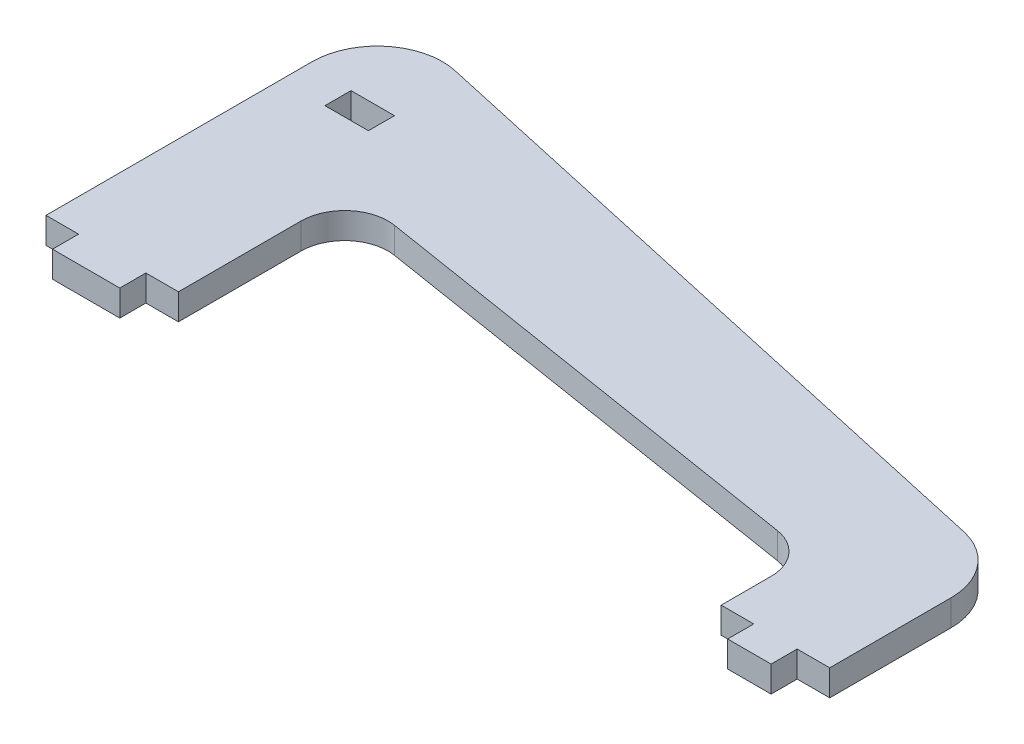
ISO-10303-21;
HEADER;
FILE_DESCRIPTION(('STEP AP214'),'2;1');
FILE_NAME('part.step','',(''),(''),'','','');
FILE_SCHEMA(('AUTOMOTIVE_DESIGN { 1 0 10303 214 1 1 1 1 }'));
ENDSEC;
DATA;
#1=APPLICATION_CONTEXT('core data for automotive mechanical design processes');
#2=APPLICATION_PROTOCOL_DEFINITION('international standard','automotive_design',2000,#1);
#3=PRODUCT_CONTEXT('',#1,'mechanical');
#4=PRODUCT('Part','Part','',(#3));
#5=PRODUCT_RELATED_PRODUCT_CATEGORY('part','',(#4));
#6=PRODUCT_DEFINITION_FORMATION('','',#4);
#7=PRODUCT_DEFINITION_CONTEXT('part definition',#1,'design');
#8=PRODUCT_DEFINITION('design','',#6,#7);
#9=PRODUCT_DEFINITION_SHAPE('','',#8);
#10=(LENGTH_UNIT() NAMED_UNIT(*) SI_UNIT(.MILLI.,.METRE.));
#11=(NAMED_UNIT(*) PLANE_ANGLE_UNIT() SI_UNIT($,.RADIAN.));
#12=(NAMED_UNIT(*) SI_UNIT($,.STERADIAN.) SOLID_ANGLE_UNIT());
#13=UNCERTAINTY_MEASURE_WITH_UNIT(LENGTH_MEASURE(1.E-05),#10,'distance_accuracy_value','');
#14=(GEOMETRIC_REPRESENTATION_CONTEXT(3) GLOBAL_UNCERTAINTY_ASSIGNED_CONTEXT((#13)) GLOBAL_UNIT_ASSIGNED_CONTEXT((#10,
#11,#12)) REPRESENTATION_CONTEXT('',''));
#15=CARTESIAN_POINT('',(0.,0.,0.));
#16=DIRECTION('',(0.,0.,1.));
#17=DIRECTION('',(1.,0.,0.));
#18=AXIS2_PLACEMENT_3D('',#15,#16,#17);
#19=CARTESIAN_POINT('',(2.5,6.,-37.6823685563129));
#20=DIRECTION('',(0.,1.,0.));
#21=DIRECTION('',(0.,0.,1.));
#22=AXIS2_PLACEMENT_3D('',#19,#20,#21);
#23=PLANE('',#22);
#24=DIRECTION('',(0.,0.,-1.));
#25=VECTOR('',#24,1.);
#26=CARTESIAN_POINT('',(10.,6.,-3.72217585492199));
#27=LINE('',#26,#25);
#28=CARTESIAN_POINT('',(10.,6.,-3.72217585492199));
#29=VERTEX_POINT('',#28);
#30=CARTESIAN_POINT('',(10.,6.,-9.72217585492199));
#31=VERTEX_POINT('',#30);
#32=EDGE_CURVE('E232',#29,#31,#27,.T.);
#33=ORIENTED_EDGE('',*,*,#32,.T.);
#34=DIRECTION('',(1.,0.,0.));
#35=VECTOR('',#34,1.);
#36=CARTESIAN_POINT('',(10.,6.,-9.72217585492199));
#37=LINE('',#36,#35);
#38=CARTESIAN_POINT('',(17.5,6.,-9.72217585492199));
#39=VERTEX_POINT('',#38);
#40=EDGE_CURVE('E235',#31,#39,#37,.T.);
#41=ORIENTED_EDGE('',*,*,#40,.T.);
#42=DIRECTION('',(0.,0.,-1.));
#43=VECTOR('',#42,1.);
#44=CARTESIAN_POINT('',(17.5,6.,-9.72217585492199));
#45=LINE('',#44,#43);
#46=CARTESIAN_POINT('',(17.5,6.,-37.6823685563129));
#47=VERTEX_POINT('',#46);
#48=EDGE_CURVE('E238',#39,#47,#45,.T.);
#49=ORIENTED_EDGE('',*,*,#48,.T.);
#50=CARTESIAN_POINT('',(2.5,6.,-37.6823685563129));
#51=DIRECTION('',(0.,1.,0.));
#52=DIRECTION('',(0.,0.,1.));
#53=AXIS2_PLACEMENT_3D('',#50,#51,#52);
#54=CIRCLE('',#53,15.);
#55=CARTESIAN_POINT('',(5.74536563354445,6.,-52.3270809776822));
#56=VERTEX_POINT('',#55);
#57=EDGE_CURVE('E240',#47,#56,#54,.T.);
#58=ORIENTED_EDGE('',*,*,#57,.T.);
#59=DIRECTION('',(-0.976314161424621,0.,-0.216357708902963));
#60=VECTOR('',#59,1.);
#61=CARTESIAN_POINT('',(5.74536563354445,6.,-52.3270809776822));
#62=LINE('',#61,#60);
#63=CARTESIAN_POINT('',(-144.754634366456,6.,-85.6788815316988));
#64=VERTEX_POINT('',#63);
#65=EDGE_CURVE('E242',#56,#64,#62,.T.);
#66=ORIENTED_EDGE('',*,*,#65,.T.);
#67=CARTESIAN_POINT('',(-148.,6.,-71.0341691103295));
#68=DIRECTION('',(0.,1.,0.));
#69=DIRECTION('',(0.,0.,-1.));
#70=AXIS2_PLACEMENT_3D('',#67,#68,#69);
#71=CIRCLE('',#70,15.);
#72=CARTESIAN_POINT('',(-163.,6.,-71.0341691103295));
#73=VERTEX_POINT('',#72);
#74=EDGE_CURVE('E244',#64,#73,#71,.T.);
#75=ORIENTED_EDGE('',*,*,#74,.T.);
#76=DIRECTION('',(0.,0.,1.));
#77=VECTOR('',#76,1.);
#78=CARTESIAN_POINT('',(-163.,6.,-9.72217585492198));
#79=LINE('',#78,#77);
#80=CARTESIAN_POINT('',(-163.,6.,-9.72217585492198));
#81=VERTEX_POINT('',#80);
#82=EDGE_CURVE('E246',#73,#81,#79,.T.);
#83=ORIENTED_EDGE('',*,*,#82,.T.);
#84=DIRECTION('',(1.,0.,0.));
#85=VECTOR('',#84,1.);
#86=CARTESIAN_POINT('',(-155.5,6.,-9.72217585492198));
#87=LINE('',#86,#85);
#88=CARTESIAN_POINT('',(-155.5,6.,-9.72217585492198));
#89=VERTEX_POINT('',#88);
#90=EDGE_CURVE('E248',#81,#89,#87,.T.);
#91=ORIENTED_EDGE('',*,*,#90,.T.);
#92=DIRECTION('',(0.,0.,1.));
#93=VECTOR('',#92,1.);
#94=CARTESIAN_POINT('',(-155.5,6.,-3.72217585492198));
#95=LINE('',#94,#93);
#96=CARTESIAN_POINT('',(-155.5,6.,-3.72217585492198));
#97=VERTEX_POINT('',#96);
#98=EDGE_CURVE('E250',#89,#97,#95,.T.);
#99=ORIENTED_EDGE('',*,*,#98,.T.);
#100=DIRECTION('',(1.,0.,0.));
#101=VECTOR('',#100,1.);
#102=CARTESIAN_POINT('',(-140.,6.,-3.72217585492199));
#103=LINE('',#102,#101);
#104=CARTESIAN_POINT('',(-140.,6.,-3.72217585492199));
#105=VERTEX_POINT('',#104);
#106=EDGE_CURVE('E252',#97,#105,#103,.T.);
#107=ORIENTED_EDGE('',*,*,#106,.T.);
#108=DIRECTION('',(0.,0.,-1.));
#109=VECTOR('',#108,1.);
#110=CARTESIAN_POINT('',(-140.,6.,-9.72217585492199));
#111=LINE('',#110,#109);
#112=CARTESIAN_POINT('',(-140.,6.,-9.72217585492199));
#113=VERTEX_POINT('',#112);
#114=EDGE_CURVE('E254',#105,#113,#111,.T.);
#115=ORIENTED_EDGE('',*,*,#114,.T.);
#116=DIRECTION('',(1.,0.,0.));
#117=VECTOR('',#116,1.);
#118=CARTESIAN_POINT('',(-132.5,6.,-9.72217585492199));
#119=LINE('',#118,#117);
#120=CARTESIAN_POINT('',(-132.5,6.,-9.72217585492199));
#121=VERTEX_POINT('',#120);
#122=EDGE_CURVE('E256',#113,#121,#119,.T.);
#123=ORIENTED_EDGE('',*,*,#122,.T.);
#124=DIRECTION('',(0.,0.,-1.));
#125=VECTOR('',#124,1.);
#126=CARTESIAN_POINT('',(-132.5,6.,-37.9949847339843));
#127=LINE('',#126,#125);
#128=CARTESIAN_POINT('',(-132.5,6.,-37.9949847339843));
#129=VERTEX_POINT('',#128);
#130=EDGE_CURVE('E258',#121,#129,#127,.T.);
#131=ORIENTED_EDGE('',*,*,#130,.T.);
#132=CARTESIAN_POINT('',(-122.5,6.,-37.9949847339843));
#133=DIRECTION('',(0.,-1.,0.));
#134=DIRECTION('',(0.,0.,1.));
#135=AXIS2_PLACEMENT_3D('',#132,#133,#134);
#136=CIRCLE('',#135,9.99999999999998);
#137=CARTESIAN_POINT('',(-120.920094988933,6.,-47.8693910531513));
#138=VERTEX_POINT('',#137);
#139=EDGE_CURVE('E260',#129,#138,#136,.T.);
#140=ORIENTED_EDGE('',*,*,#139,.T.);
#141=DIRECTION('',(0.987440631916705,0.,0.157990501106673));
#142=VECTOR('',#141,1.);
#143=CARTESIAN_POINT('',(-15.9200949889333,6.,-31.0693910531513));
#144=LINE('',#143,#142);
#145=CARTESIAN_POINT('',(-15.9200949889333,6.,-31.0693910531513));
#146=VERTEX_POINT('',#145);
#147=EDGE_CURVE('E262',#138,#146,#144,.T.);
#148=ORIENTED_EDGE('',*,*,#147,.T.);
#149=CARTESIAN_POINT('',(-17.5,6.,-21.1949847339843));
#150=DIRECTION('',(0.,-1.,0.));
#151=DIRECTION('',(0.,0.,1.));
#152=AXIS2_PLACEMENT_3D('',#149,#150,#151);
#153=CIRCLE('',#152,10.);
#154=CARTESIAN_POINT('',(-7.5,6.,-21.1949847339843));
#155=VERTEX_POINT('',#154);
#156=EDGE_CURVE('E264',#146,#155,#153,.T.);
#157=ORIENTED_EDGE('',*,*,#156,.T.);
#158=DIRECTION('',(0.,0.,1.));
#159=VECTOR('',#158,1.);
#160=CARTESIAN_POINT('',(-7.5,6.,-9.72217585492199));
#161=LINE('',#160,#159);
#162=CARTESIAN_POINT('',(-7.5,6.,-9.72217585492199));
#163=VERTEX_POINT('',#162);
#164=EDGE_CURVE('E266',#155,#163,#161,.T.);
#165=ORIENTED_EDGE('',*,*,#164,.T.);
#166=DIRECTION('',(1.,0.,0.));
#167=VECTOR('',#166,1.);
#168=CARTESIAN_POINT('',(0.,6.,-9.72217585492199));
#169=LINE('',#168,#167);
#170=CARTESIAN_POINT('',(0.,6.,-9.72217585492199));
#171=VERTEX_POINT('',#170);
#172=EDGE_CURVE('E268',#163,#171,#169,.T.);
#173=ORIENTED_EDGE('',*,*,#172,.T.);
#174=DIRECTION('',(0.,0.,1.));
#175=VECTOR('',#174,1.);
#176=CARTESIAN_POINT('',(0.,6.,-9.72217585492199));
#177=LINE('',#176,#175);
#178=CARTESIAN_POINT('',(0.,6.,-3.72217585492199));
#179=VERTEX_POINT('',#178);
#180=EDGE_CURVE('E270',#171,#179,#177,.T.);
#181=ORIENTED_EDGE('',*,*,#180,.T.);
#182=DIRECTION('',(1.,0.,0.));
#183=VECTOR('',#182,1.);
#184=CARTESIAN_POINT('',(0.,6.,-3.72217585492199));
#185=LINE('',#184,#183);
#186=EDGE_CURVE('E272',#179,#29,#185,.T.);
#187=ORIENTED_EDGE('',*,*,#186,.T.);
#188=EDGE_LOOP('',(#33,#41,#49,#58,#66,#75,#83,#91,#99,#107,#115,#123,#131,#140,#148,#157,#165,
#173,#181,#187));
#189=FACE_BOUND('',#188,.T.);
#190=DIRECTION('',(-1.,0.,0.));
#191=VECTOR('',#190,1.);
#192=CARTESIAN_POINT('',(-142.75,6.,-69.722175854922));
#193=LINE('',#192,#191);
#194=CARTESIAN_POINT('',(-142.75,6.,-69.722175854922));
#195=VERTEX_POINT('',#194);
#196=CARTESIAN_POINT('',(-152.75,6.,-69.722175854922));
#197=VERTEX_POINT('',#196);
#198=EDGE_CURVE('E204',#195,#197,#193,.T.);
#199=ORIENTED_EDGE('',*,*,#198,.F.);
#200=DIRECTION('',(0.,0.,-1.));
#201=VECTOR('',#200,1.);
#202=CARTESIAN_POINT('',(-142.75,6.,-63.722175854922));
#203=LINE('',#202,#201);
#204=CARTESIAN_POINT('',(-142.75,6.,-63.722175854922));
#205=VERTEX_POINT('',#204);
#206=EDGE_CURVE('E196',#205,#195,#203,.T.);
#207=ORIENTED_EDGE('',*,*,#206,.F.);
#208=DIRECTION('',(1.,0.,0.));
#209=VECTOR('',#208,1.);
#210=CARTESIAN_POINT('',(-152.75,6.,-63.722175854922));
#211=LINE('',#210,#209);
#212=CARTESIAN_POINT('',(-152.75,6.,-63.722175854922));
#213=VERTEX_POINT('',#212);
#214=EDGE_CURVE('E218',#213,#205,#211,.T.);
#215=ORIENTED_EDGE('',*,*,#214,.F.);
#216=DIRECTION('',(0.,0.,1.));
#217=VECTOR('',#216,1.);
#218=CARTESIAN_POINT('',(-152.75,6.,-69.722175854922));
#219=LINE('',#218,#217);
#220=EDGE_CURVE('E216',#197,#213,#219,.T.);
#221=ORIENTED_EDGE('',*,*,#220,.F.);
#222=EDGE_LOOP('',(#199,#207,#215,#221));
#223=FACE_BOUND('',#222,.T.);
#224=ADVANCED_FACE('F35',(#189,#223),#23,.T.);
#225=CARTESIAN_POINT('',(2.5,0.,-37.6823685563129));
#226=DIRECTION('',(0.,1.,0.));
#227=DIRECTION('',(0.,0.,1.));
#228=AXIS2_PLACEMENT_3D('',#225,#226,#227);
#229=PLANE('',#228);
#230=DIRECTION('',(0.,0.,-1.));
#231=VECTOR('',#230,1.);
#232=CARTESIAN_POINT('',(10.,0.,-3.72217585492199));
#233=LINE('',#232,#231);
#234=CARTESIAN_POINT('',(10.,0.,-3.72217585492199));
#235=VERTEX_POINT('',#234);
#236=CARTESIAN_POINT('',(10.,0.,-9.72217585492199));
#237=VERTEX_POINT('',#236);
#238=EDGE_CURVE('E212',#235,#237,#233,.T.);
#239=ORIENTED_EDGE('',*,*,#238,.F.);
#240=DIRECTION('',(1.,0.,0.));
#241=VECTOR('',#240,1.);
#242=CARTESIAN_POINT('',(0.,0.,-3.72217585492199));
#243=LINE('',#242,#241);
#244=CARTESIAN_POINT('',(0.,0.,-3.72217585492199));
#245=VERTEX_POINT('',#244);
#246=EDGE_CURVE('E236',#245,#235,#243,.T.);
#247=ORIENTED_EDGE('',*,*,#246,.F.);
#248=DIRECTION('',(0.,0.,1.));
#249=VECTOR('',#248,1.);
#250=CARTESIAN_POINT('',(0.,0.,-9.72217585492199));
#251=LINE('',#250,#249);
#252=CARTESIAN_POINT('',(0.,0.,-9.72217585492199));
#253=VERTEX_POINT('',#252);
#254=EDGE_CURVE('E311',#253,#245,#251,.T.);
#255=ORIENTED_EDGE('',*,*,#254,.F.);
#256=DIRECTION('',(1.,0.,0.));
#257=VECTOR('',#256,1.);
#258=CARTESIAN_POINT('',(0.,0.,-9.72217585492199));
#259=LINE('',#258,#257);
#260=CARTESIAN_POINT('',(-7.5,0.,-9.72217585492199));
#261=VERTEX_POINT('',#260);
#262=EDGE_CURVE('E309',#261,#253,#259,.T.);
#263=ORIENTED_EDGE('',*,*,#262,.F.);
#264=DIRECTION('',(0.,0.,1.));
#265=VECTOR('',#264,1.);
#266=CARTESIAN_POINT('',(-7.5,0.,-9.72217585492199));
#267=LINE('',#266,#265);
#268=CARTESIAN_POINT('',(-7.5,0.,-21.1949847339843));
#269=VERTEX_POINT('',#268);
#270=EDGE_CURVE('E307',#269,#261,#267,.T.);
#271=ORIENTED_EDGE('',*,*,#270,.F.);
#272=CARTESIAN_POINT('',(-17.5,0.,-21.1949847339843));
#273=DIRECTION('',(0.,-1.,0.));
#274=DIRECTION('',(0.,0.,1.));
#275=AXIS2_PLACEMENT_3D('',#272,#273,#274);
#276=CIRCLE('',#275,10.);
#277=CARTESIAN_POINT('',(-15.9200949889333,0.,-31.0693910531513));
#278=VERTEX_POINT('',#277);
#279=EDGE_CURVE('E305',#278,#269,#276,.T.);
#280=ORIENTED_EDGE('',*,*,#279,.F.);
#281=DIRECTION('',(0.987440631916705,0.,0.157990501106673));
#282=VECTOR('',#281,1.);
#283=CARTESIAN_POINT('',(-15.9200949889333,0.,-31.0693910531513));
#284=LINE('',#283,#282);
#285=CARTESIAN_POINT('',(-120.920094988933,0.,-47.8693910531513));
#286=VERTEX_POINT('',#285);
#287=EDGE_CURVE('E303',#286,#278,#284,.T.);
#288=ORIENTED_EDGE('',*,*,#287,.F.);
#289=CARTESIAN_POINT('',(-122.5,0.,-37.9949847339843));
#290=DIRECTION('',(0.,-1.,0.));
#291=DIRECTION('',(0.,0.,1.));
#292=AXIS2_PLACEMENT_3D('',#289,#290,#291);
#293=CIRCLE('',#292,9.99999999999998);
#294=CARTESIAN_POINT('',(-132.5,0.,-37.9949847339843));
#295=VERTEX_POINT('',#294);
#296=EDGE_CURVE('E301',#295,#286,#293,.T.);
#297=ORIENTED_EDGE('',*,*,#296,.F.);
#298=DIRECTION('',(0.,0.,-1.));
#299=VECTOR('',#298,1.);
#300=CARTESIAN_POINT('',(-132.5,0.,-37.9949847339843));
#301=LINE('',#300,#299);
#302=CARTESIAN_POINT('',(-132.5,0.,-9.72217585492199));
#303=VERTEX_POINT('',#302);
#304=EDGE_CURVE('E299',#303,#295,#301,.T.);
#305=ORIENTED_EDGE('',*,*,#304,.F.);
#306=DIRECTION('',(1.,0.,0.));
#307=VECTOR('',#306,1.);
#308=CARTESIAN_POINT('',(-132.5,0.,-9.72217585492199));
#309=LINE('',#308,#307);
#310=CARTESIAN_POINT('',(-140.,0.,-9.72217585492199));
#311=VERTEX_POINT('',#310);
#312=EDGE_CURVE('E297',#311,#303,#309,.T.);
#313=ORIENTED_EDGE('',*,*,#312,.F.);
#314=DIRECTION('',(0.,0.,-1.));
#315=VECTOR('',#314,1.);
#316=CARTESIAN_POINT('',(-140.,0.,-9.72217585492199));
#317=LINE('',#316,#315);
#318=CARTESIAN_POINT('',(-140.,0.,-3.72217585492199));
#319=VERTEX_POINT('',#318);
#320=EDGE_CURVE('E295',#319,#311,#317,.T.);
#321=ORIENTED_EDGE('',*,*,#320,.F.);
#322=DIRECTION('',(1.,0.,0.));
#323=VECTOR('',#322,1.);
#324=CARTESIAN_POINT('',(-140.,0.,-3.72217585492199));
#325=LINE('',#324,#323);
#326=CARTESIAN_POINT('',(-155.5,0.,-3.72217585492198));
#327=VERTEX_POINT('',#326);
#328=EDGE_CURVE('E293',#327,#319,#325,.T.);
#329=ORIENTED_EDGE('',*,*,#328,.F.);
#330=DIRECTION('',(0.,0.,1.));
#331=VECTOR('',#330,1.);
#332=CARTESIAN_POINT('',(-155.5,0.,-3.72217585492198));
#333=LINE('',#332,#331);
#334=CARTESIAN_POINT('',(-155.5,0.,-9.72217585492198));
#335=VERTEX_POINT('',#334);
#336=EDGE_CURVE('E291',#335,#327,#333,.T.);
#337=ORIENTED_EDGE('',*,*,#336,.F.);
#338=DIRECTION('',(1.,0.,0.));
#339=VECTOR('',#338,1.);
#340=CARTESIAN_POINT('',(-155.5,0.,-9.72217585492198));
#341=LINE('',#340,#339);
#342=CARTESIAN_POINT('',(-163.,0.,-9.72217585492198));
#343=VERTEX_POINT('',#342);
#344=EDGE_CURVE('E289',#343,#335,#341,.T.);
#345=ORIENTED_EDGE('',*,*,#344,.F.);
#346=DIRECTION('',(0.,0.,1.));
#347=VECTOR('',#346,1.);
#348=CARTESIAN_POINT('',(-163.,0.,-9.72217585492198));
#349=LINE('',#348,#347);
#350=CARTESIAN_POINT('',(-163.,0.,-71.0341691103295));
#351=VERTEX_POINT('',#350);
#352=EDGE_CURVE('E287',#351,#343,#349,.T.);
#353=ORIENTED_EDGE('',*,*,#352,.F.);
#354=CARTESIAN_POINT('',(-148.,0.,-71.0341691103295));
#355=DIRECTION('',(0.,1.,0.));
#356=DIRECTION('',(0.,0.,-1.));
#357=AXIS2_PLACEMENT_3D('',#354,#355,#356);
#358=CIRCLE('',#357,15.);
#359=CARTESIAN_POINT('',(-144.754634366456,0.,-85.6788815316988));
#360=VERTEX_POINT('',#359);
#361=EDGE_CURVE('E285',#360,#351,#358,.T.);
#362=ORIENTED_EDGE('',*,*,#361,.F.);
#363=DIRECTION('',(-0.976314161424621,0.,-0.216357708902963));
#364=VECTOR('',#363,1.);
#365=CARTESIAN_POINT('',(5.74536563354445,0.,-52.3270809776822));
#366=LINE('',#365,#364);
#367=CARTESIAN_POINT('',(5.74536563354445,0.,-52.3270809776822));
#368=VERTEX_POINT('',#367);
#369=EDGE_CURVE('E283',#368,#360,#366,.T.);
#370=ORIENTED_EDGE('',*,*,#369,.F.);
#371=CARTESIAN_POINT('',(2.5,0.,-37.6823685563129));
#372=DIRECTION('',(0.,1.,0.));
#373=DIRECTION('',(0.,0.,1.));
#374=AXIS2_PLACEMENT_3D('',#371,#372,#373);
#375=CIRCLE('',#374,15.);
#376=CARTESIAN_POINT('',(17.5,0.,-37.6823685563129));
#377=VERTEX_POINT('',#376);
#378=EDGE_CURVE('E281',#377,#368,#375,.T.);
#379=ORIENTED_EDGE('',*,*,#378,.F.);
#380=DIRECTION('',(0.,0.,-1.));
#381=VECTOR('',#380,1.);
#382=CARTESIAN_POINT('',(17.5,0.,-9.72217585492199));
#383=LINE('',#382,#381);
#384=CARTESIAN_POINT('',(17.5,0.,-9.72217585492199));
#385=VERTEX_POINT('',#384);
#386=EDGE_CURVE('E279',#385,#377,#383,.T.);
#387=ORIENTED_EDGE('',*,*,#386,.F.);
#388=DIRECTION('',(1.,0.,0.));
#389=VECTOR('',#388,1.);
#390=CARTESIAN_POINT('',(10.,0.,-9.72217585492199));
#391=LINE('',#390,#389);
#392=EDGE_CURVE('E277',#237,#385,#391,.T.);
#393=ORIENTED_EDGE('',*,*,#392,.F.);
#394=EDGE_LOOP('',(#239,#247,#255,#263,#271,#280,#288,#297,#305,#313,#321,#329,#337,#345,#353,
#362,#370,#379,#387,#393));
#395=FACE_BOUND('',#394,.T.);
#396=DIRECTION('',(0.,0.,-1.));
#397=VECTOR('',#396,1.);
#398=CARTESIAN_POINT('',(-142.75,0.,-63.722175854922));
#399=LINE('',#398,#397);
#400=CARTESIAN_POINT('',(-142.75,0.,-63.722175854922));
#401=VERTEX_POINT('',#400);
#402=CARTESIAN_POINT('',(-142.75,0.,-69.722175854922));
#403=VERTEX_POINT('',#402);
#404=EDGE_CURVE('E58',#401,#403,#399,.T.);
#405=ORIENTED_EDGE('',*,*,#404,.T.);
#406=DIRECTION('',(-1.,0.,0.));
#407=VECTOR('',#406,1.);
#408=CARTESIAN_POINT('',(-142.75,0.,-69.722175854922));
#409=LINE('',#408,#407);
#410=CARTESIAN_POINT('',(-152.75,0.,-69.722175854922));
#411=VERTEX_POINT('',#410);
#412=EDGE_CURVE('E211',#403,#411,#409,.T.);
#413=ORIENTED_EDGE('',*,*,#412,.T.);
#414=DIRECTION('',(0.,0.,1.));
#415=VECTOR('',#414,1.);
#416=CARTESIAN_POINT('',(-152.75,0.,-69.722175854922));
#417=LINE('',#416,#415);
#418=CARTESIAN_POINT('',(-152.75,0.,-63.722175854922));
#419=VERTEX_POINT('',#418);
#420=EDGE_CURVE('E224',#411,#419,#417,.T.);
#421=ORIENTED_EDGE('',*,*,#420,.T.);
#422=DIRECTION('',(1.,0.,0.));
#423=VECTOR('',#422,1.);
#424=CARTESIAN_POINT('',(-152.75,0.,-63.722175854922));
#425=LINE('',#424,#423);
#426=EDGE_CURVE('E205',#419,#401,#425,.T.);
#427=ORIENTED_EDGE('',*,*,#426,.T.);
#428=EDGE_LOOP('',(#405,#413,#421,#427));
#429=FACE_BOUND('',#428,.T.);
#430=ADVANCED_FACE('F377',(#395,#429),#229,.F.);
#431=CARTESIAN_POINT('',(10.,6.,-3.72217585492199));
#432=DIRECTION('',(-1.,0.,0.));
#433=DIRECTION('',(0.,0.,1.));
#434=AXIS2_PLACEMENT_3D('',#431,#432,#433);
#435=PLANE('',#434);
#436=ORIENTED_EDGE('',*,*,#238,.T.);
#437=DIRECTION('',(0.,-1.,0.));
#438=VECTOR('',#437,1.);
#439=CARTESIAN_POINT('',(10.,6.,-9.72217585492199));
#440=LINE('',#439,#438);
#441=EDGE_CURVE('E11',#31,#237,#440,.T.);
#442=ORIENTED_EDGE('',*,*,#441,.F.);
#443=ORIENTED_EDGE('',*,*,#32,.F.);
#444=DIRECTION('',(0.,-1.,0.));
#445=VECTOR('',#444,1.);
#446=CARTESIAN_POINT('',(10.,6.,-3.72217585492199));
#447=LINE('',#446,#445);
#448=EDGE_CURVE('E274',#29,#235,#447,.T.);
#449=ORIENTED_EDGE('',*,*,#448,.T.);
#450=EDGE_LOOP('',(#436,#442,#443,#449));
#451=FACE_BOUND('',#450,.T.);
#452=ADVANCED_FACE('F37',(#451),#435,.F.);
#453=CARTESIAN_POINT('',(10.,6.,-9.72217585492199));
#454=DIRECTION('',(0.,0.,-1.));
#455=DIRECTION('',(-1.,0.,0.));
#456=AXIS2_PLACEMENT_3D('',#453,#454,#455);
#457=PLANE('',#456);
#458=ORIENTED_EDGE('',*,*,#392,.T.);
#459=DIRECTION('',(0.,-1.,0.));
#460=VECTOR('',#459,1.);
#461=CARTESIAN_POINT('',(17.5,6.,-9.72217585492199));
#462=LINE('',#461,#460);
#463=EDGE_CURVE('E43',#39,#385,#462,.T.);
#464=ORIENTED_EDGE('',*,*,#463,.F.);
#465=ORIENTED_EDGE('',*,*,#40,.F.);
#466=ORIENTED_EDGE('',*,*,#441,.T.);
#467=EDGE_LOOP('',(#458,#464,#465,#466));
#468=FACE_BOUND('',#467,.T.);
#469=ADVANCED_FACE('F394',(#468),#457,.F.);
#470=CARTESIAN_POINT('',(17.5,6.,-9.72217585492199));
#471=DIRECTION('',(-1.,0.,0.));
#472=DIRECTION('',(0.,0.,1.));
#473=AXIS2_PLACEMENT_3D('',#470,#471,#472);
#474=PLANE('',#473);
#475=ORIENTED_EDGE('',*,*,#386,.T.);
#476=DIRECTION('',(0.,-1.,0.));
#477=VECTOR('',#476,1.);
#478=CARTESIAN_POINT('',(17.5,6.,-37.6823685563129));
#479=LINE('',#478,#477);
#480=EDGE_CURVE('E364',#47,#377,#479,.T.);
#481=ORIENTED_EDGE('',*,*,#480,.F.);
#482=ORIENTED_EDGE('',*,*,#48,.F.);
#483=ORIENTED_EDGE('',*,*,#463,.T.);
#484=EDGE_LOOP('',(#475,#481,#482,#483));
#485=FACE_BOUND('',#484,.T.);
#486=ADVANCED_FACE('F371',(#485),#474,.F.);
#487=CARTESIAN_POINT('',(2.5,6.,-37.6823685563129));
#488=DIRECTION('',(0.,-1.,0.));
#489=DIRECTION('',(0.,0.,-1.));
#490=AXIS2_PLACEMENT_3D('',#487,#488,#489);
#491=CYLINDRICAL_SURFACE('',#490,15.);
#492=ORIENTED_EDGE('',*,*,#378,.T.);
#493=DIRECTION('',(0.,-1.,0.));
#494=VECTOR('',#493,1.);
#495=CARTESIAN_POINT('',(5.74536563354445,6.,-52.3270809776822));
#496=LINE('',#495,#494);
#497=EDGE_CURVE('E361',#56,#368,#496,.T.);
#498=ORIENTED_EDGE('',*,*,#497,.F.);
#499=ORIENTED_EDGE('',*,*,#57,.F.);
#500=ORIENTED_EDGE('',*,*,#480,.T.);
#501=EDGE_LOOP('',(#492,#498,#499,#500));
#502=FACE_BOUND('',#501,.T.);
#503=ADVANCED_FACE('F383',(#502),#491,.T.);
#504=CARTESIAN_POINT('',(5.74536563354445,6.,-52.3270809776822));
#505=DIRECTION('',(-0.216357708902963,0.,0.976314161424621));
#506=DIRECTION('',(0.976314161424621,0.,0.216357708902963));
#507=AXIS2_PLACEMENT_3D('',#504,#505,#506);
#508=PLANE('',#507);
#509=ORIENTED_EDGE('',*,*,#369,.T.);
#510=DIRECTION('',(0.,-1.,0.));
#511=VECTOR('',#510,1.);
#512=CARTESIAN_POINT('',(-144.754634366456,6.,-85.6788815316988));
#513=LINE('',#512,#511);
#514=EDGE_CURVE('E358',#64,#360,#513,.T.);
#515=ORIENTED_EDGE('',*,*,#514,.F.);
#516=ORIENTED_EDGE('',*,*,#65,.F.);
#517=ORIENTED_EDGE('',*,*,#497,.T.);
#518=EDGE_LOOP('',(#509,#515,#516,#517));
#519=FACE_BOUND('',#518,.T.);
#520=ADVANCED_FACE('F387',(#519),#508,.F.);
#521=CARTESIAN_POINT('',(-148.,6.,-71.0341691103295));
#522=DIRECTION('',(0.,-1.,0.));
#523=DIRECTION('',(0.,0.,-1.));
#524=AXIS2_PLACEMENT_3D('',#521,#522,#523);
#525=CYLINDRICAL_SURFACE('',#524,15.);
#526=ORIENTED_EDGE('',*,*,#361,.T.);
#527=DIRECTION('',(0.,-1.,0.));
#528=VECTOR('',#527,1.);
#529=CARTESIAN_POINT('',(-163.,6.,-71.0341691103295));
#530=LINE('',#529,#528);
#531=EDGE_CURVE('E355',#73,#351,#530,.T.);
#532=ORIENTED_EDGE('',*,*,#531,.F.);
#533=ORIENTED_EDGE('',*,*,#74,.F.);
#534=ORIENTED_EDGE('',*,*,#514,.T.);
#535=EDGE_LOOP('',(#526,#532,#533,#534));
#536=FACE_BOUND('',#535,.T.);
#537=ADVANCED_FACE('F467',(#536),#525,.T.);
#538=CARTESIAN_POINT('',(-163.,6.,-9.72217585492198));
#539=DIRECTION('',(1.,0.,0.));
#540=DIRECTION('',(0.,0.,-1.));
#541=AXIS2_PLACEMENT_3D('',#538,#539,#540);
#542=PLANE('',#541);
#543=ORIENTED_EDGE('',*,*,#352,.T.);
#544=DIRECTION('',(0.,-1.,0.));
#545=VECTOR('',#544,1.);
#546=CARTESIAN_POINT('',(-163.,6.,-9.72217585492198));
#547=LINE('',#546,#545);
#548=EDGE_CURVE('E352',#81,#343,#547,.T.);
#549=ORIENTED_EDGE('',*,*,#548,.F.);
#550=ORIENTED_EDGE('',*,*,#82,.F.);
#551=ORIENTED_EDGE('',*,*,#531,.T.);
#552=EDGE_LOOP('',(#543,#549,#550,#551));
#553=FACE_BOUND('',#552,.T.);
#554=ADVANCED_FACE('F465',(#553),#542,.F.);
#555=CARTESIAN_POINT('',(-155.5,6.,-9.72217585492198));
#556=DIRECTION('',(0.,0.,-1.));
#557=DIRECTION('',(-1.,0.,0.));
#558=AXIS2_PLACEMENT_3D('',#555,#556,#557);
#559=PLANE('',#558);
#560=ORIENTED_EDGE('',*,*,#344,.T.);
#561=DIRECTION('',(0.,-1.,0.));
#562=VECTOR('',#561,1.);
#563=CARTESIAN_POINT('',(-155.5,6.,-9.72217585492198));
#564=LINE('',#563,#562);
#565=EDGE_CURVE('E349',#89,#335,#564,.T.);
#566=ORIENTED_EDGE('',*,*,#565,.F.);
#567=ORIENTED_EDGE('',*,*,#90,.F.);
#568=ORIENTED_EDGE('',*,*,#548,.T.);
#569=EDGE_LOOP('',(#560,#566,#567,#568));
#570=FACE_BOUND('',#569,.T.);
#571=ADVANCED_FACE('F460',(#570),#559,.F.);
#572=CARTESIAN_POINT('',(-155.5,6.,-3.72217585492198));
#573=DIRECTION('',(1.,0.,0.));
#574=DIRECTION('',(0.,0.,-1.));
#575=AXIS2_PLACEMENT_3D('',#572,#573,#574);
#576=PLANE('',#575);
#577=ORIENTED_EDGE('',*,*,#336,.T.);
#578=DIRECTION('',(0.,-1.,0.));
#579=VECTOR('',#578,1.);
#580=CARTESIAN_POINT('',(-155.5,6.,-3.72217585492198));
#581=LINE('',#580,#579);
#582=EDGE_CURVE('E346',#97,#327,#581,.T.);
#583=ORIENTED_EDGE('',*,*,#582,.F.);
#584=ORIENTED_EDGE('',*,*,#98,.F.);
#585=ORIENTED_EDGE('',*,*,#565,.T.);
#586=EDGE_LOOP('',(#577,#583,#584,#585));
#587=FACE_BOUND('',#586,.T.);
#588=ADVANCED_FACE('F455',(#587),#576,.F.);
#589=CARTESIAN_POINT('',(-140.,6.,-3.72217585492199));
#590=DIRECTION('',(0.,0.,-1.));
#591=DIRECTION('',(-1.,0.,0.));
#592=AXIS2_PLACEMENT_3D('',#589,#590,#591);
#593=PLANE('',#592);
#594=ORIENTED_EDGE('',*,*,#328,.T.);
#595=DIRECTION('',(0.,-1.,0.));
#596=VECTOR('',#595,1.);
#597=CARTESIAN_POINT('',(-140.,6.,-3.72217585492199));
#598=LINE('',#597,#596);
#599=EDGE_CURVE('E343',#105,#319,#598,.T.);
#600=ORIENTED_EDGE('',*,*,#599,.F.);
#601=ORIENTED_EDGE('',*,*,#106,.F.);
#602=ORIENTED_EDGE('',*,*,#582,.T.);
#603=EDGE_LOOP('',(#594,#600,#601,#602));
#604=FACE_BOUND('',#603,.T.);
#605=ADVANCED_FACE('F451',(#604),#593,.F.);
#606=CARTESIAN_POINT('',(-140.,6.,-9.72217585492199));
#607=DIRECTION('',(-1.,0.,0.));
#608=DIRECTION('',(0.,0.,1.));
#609=AXIS2_PLACEMENT_3D('',#606,#607,#608);
#610=PLANE('',#609);
#611=ORIENTED_EDGE('',*,*,#320,.T.);
#612=DIRECTION('',(0.,-1.,0.));
#613=VECTOR('',#612,1.);
#614=CARTESIAN_POINT('',(-140.,6.,-9.72217585492199));
#615=LINE('',#614,#613);
#616=EDGE_CURVE('E340',#113,#311,#615,.T.);
#617=ORIENTED_EDGE('',*,*,#616,.F.);
#618=ORIENTED_EDGE('',*,*,#114,.F.);
#619=ORIENTED_EDGE('',*,*,#599,.T.);
#620=EDGE_LOOP('',(#611,#617,#618,#619));
#621=FACE_BOUND('',#620,.T.);
#622=ADVANCED_FACE('F446',(#621),#610,.F.);
#623=CARTESIAN_POINT('',(-132.5,6.,-9.72217585492199));
#624=DIRECTION('',(0.,0.,-1.));
#625=DIRECTION('',(-1.,0.,0.));
#626=AXIS2_PLACEMENT_3D('',#623,#624,#625);
#627=PLANE('',#626);
#628=ORIENTED_EDGE('',*,*,#312,.T.);
#629=DIRECTION('',(0.,-1.,0.));
#630=VECTOR('',#629,1.);
#631=CARTESIAN_POINT('',(-132.5,6.,-9.72217585492199));
#632=LINE('',#631,#630);
#633=EDGE_CURVE('E337',#121,#303,#632,.T.);
#634=ORIENTED_EDGE('',*,*,#633,.F.);
#635=ORIENTED_EDGE('',*,*,#122,.F.);
#636=ORIENTED_EDGE('',*,*,#616,.T.);
#637=EDGE_LOOP('',(#628,#634,#635,#636));
#638=FACE_BOUND('',#637,.T.);
#639=ADVANCED_FACE('F440',(#638),#627,.F.);
#640=CARTESIAN_POINT('',(-132.5,6.,-37.9949847339843));
#641=DIRECTION('',(-1.,0.,0.));
#642=DIRECTION('',(0.,0.,1.));
#643=AXIS2_PLACEMENT_3D('',#640,#641,#642);
#644=PLANE('',#643);
#645=ORIENTED_EDGE('',*,*,#304,.T.);
#646=DIRECTION('',(0.,-1.,0.));
#647=VECTOR('',#646,1.);
#648=CARTESIAN_POINT('',(-132.5,6.,-37.9949847339843));
#649=LINE('',#648,#647);
#650=EDGE_CURVE('E334',#129,#295,#649,.T.);
#651=ORIENTED_EDGE('',*,*,#650,.F.);
#652=ORIENTED_EDGE('',*,*,#130,.F.);
#653=ORIENTED_EDGE('',*,*,#633,.T.);
#654=EDGE_LOOP('',(#645,#651,#652,#653));
#655=FACE_BOUND('',#654,.T.);
#656=ADVANCED_FACE('F436',(#655),#644,.F.);
#657=CARTESIAN_POINT('',(-122.5,6.,-37.9949847339843));
#658=DIRECTION('',(0.,-1.,0.));
#659=DIRECTION('',(0.,0.,-1.));
#660=AXIS2_PLACEMENT_3D('',#657,#658,#659);
#661=CYLINDRICAL_SURFACE('',#660,9.99999999999998);
#662=ORIENTED_EDGE('',*,*,#296,.T.);
#663=DIRECTION('',(0.,-1.,0.));
#664=VECTOR('',#663,1.);
#665=CARTESIAN_POINT('',(-120.920094988933,6.,-47.8693910531513));
#666=LINE('',#665,#664);
#667=EDGE_CURVE('E331',#138,#286,#666,.T.);
#668=ORIENTED_EDGE('',*,*,#667,.F.);
#669=ORIENTED_EDGE('',*,*,#139,.F.);
#670=ORIENTED_EDGE('',*,*,#650,.T.);
#671=EDGE_LOOP('',(#662,#668,#669,#670));
#672=FACE_BOUND('',#671,.T.);
#673=ADVANCED_FACE('F431',(#672),#661,.F.);
#674=CARTESIAN_POINT('',(-15.9200949889333,6.,-31.0693910531513));
#675=DIRECTION('',(0.157990501106673,0.,-0.987440631916705));
#676=DIRECTION('',(-0.987440631916706,0.,-0.157990501106673));
#677=AXIS2_PLACEMENT_3D('',#674,#675,#676);
#678=PLANE('',#677);
#679=ORIENTED_EDGE('',*,*,#287,.T.);
#680=DIRECTION('',(0.,-1.,0.));
#681=VECTOR('',#680,1.);
#682=CARTESIAN_POINT('',(-15.9200949889333,6.,-31.0693910531513));
#683=LINE('',#682,#681);
#684=EDGE_CURVE('E328',#146,#278,#683,.T.);
#685=ORIENTED_EDGE('',*,*,#684,.F.);
#686=ORIENTED_EDGE('',*,*,#147,.F.);
#687=ORIENTED_EDGE('',*,*,#667,.T.);
#688=EDGE_LOOP('',(#679,#685,#686,#687));
#689=FACE_BOUND('',#688,.T.);
#690=ADVANCED_FACE('F425',(#689),#678,.F.);
#691=CARTESIAN_POINT('',(-17.5,6.,-21.1949847339843));
#692=DIRECTION('',(0.,-1.,0.));
#693=DIRECTION('',(0.,0.,-1.));
#694=AXIS2_PLACEMENT_3D('',#691,#692,#693);
#695=CYLINDRICAL_SURFACE('',#694,10.);
#696=ORIENTED_EDGE('',*,*,#279,.T.);
#697=DIRECTION('',(0.,-1.,0.));
#698=VECTOR('',#697,1.);
#699=CARTESIAN_POINT('',(-7.5,6.,-21.1949847339843));
#700=LINE('',#699,#698);
#701=EDGE_CURVE('E325',#155,#269,#700,.T.);
#702=ORIENTED_EDGE('',*,*,#701,.F.);
#703=ORIENTED_EDGE('',*,*,#156,.F.);
#704=ORIENTED_EDGE('',*,*,#684,.T.);
#705=EDGE_LOOP('',(#696,#702,#703,#704));
#706=FACE_BOUND('',#705,.T.);
#707=ADVANCED_FACE('F421',(#706),#695,.F.);
#708=CARTESIAN_POINT('',(-7.5,6.,-9.72217585492199));
#709=DIRECTION('',(1.,0.,0.));
#710=DIRECTION('',(0.,0.,-1.));
#711=AXIS2_PLACEMENT_3D('',#708,#709,#710);
#712=PLANE('',#711);
#713=ORIENTED_EDGE('',*,*,#270,.T.);
#714=DIRECTION('',(0.,-1.,0.));
#715=VECTOR('',#714,1.);
#716=CARTESIAN_POINT('',(-7.5,6.,-9.72217585492199));
#717=LINE('',#716,#715);
#718=EDGE_CURVE('E322',#163,#261,#717,.T.);
#719=ORIENTED_EDGE('',*,*,#718,.F.);
#720=ORIENTED_EDGE('',*,*,#164,.F.);
#721=ORIENTED_EDGE('',*,*,#701,.T.);
#722=EDGE_LOOP('',(#713,#719,#720,#721));
#723=FACE_BOUND('',#722,.T.);
#724=ADVANCED_FACE('F416',(#723),#712,.F.);
#725=CARTESIAN_POINT('',(0.,6.,-9.72217585492199));
#726=DIRECTION('',(0.,0.,-1.));
#727=DIRECTION('',(-1.,0.,0.));
#728=AXIS2_PLACEMENT_3D('',#725,#726,#727);
#729=PLANE('',#728);
#730=ORIENTED_EDGE('',*,*,#262,.T.);
#731=DIRECTION('',(0.,-1.,0.));
#732=VECTOR('',#731,1.);
#733=CARTESIAN_POINT('',(0.,6.,-9.72217585492199));
#734=LINE('',#733,#732);
#735=EDGE_CURVE('E319',#171,#253,#734,.T.);
#736=ORIENTED_EDGE('',*,*,#735,.F.);
#737=ORIENTED_EDGE('',*,*,#172,.F.);
#738=ORIENTED_EDGE('',*,*,#718,.T.);
#739=EDGE_LOOP('',(#730,#736,#737,#738));
#740=FACE_BOUND('',#739,.T.);
#741=ADVANCED_FACE('F410',(#740),#729,.F.);
#742=CARTESIAN_POINT('',(0.,6.,-9.72217585492199));
#743=DIRECTION('',(1.,0.,0.));
#744=DIRECTION('',(0.,0.,-1.));
#745=AXIS2_PLACEMENT_3D('',#742,#743,#744);
#746=PLANE('',#745);
#747=ORIENTED_EDGE('',*,*,#254,.T.);
#748=DIRECTION('',(0.,-1.,0.));
#749=VECTOR('',#748,1.);
#750=CARTESIAN_POINT('',(0.,6.,-3.72217585492199));
#751=LINE('',#750,#749);
#752=EDGE_CURVE('E316',#179,#245,#751,.T.);
#753=ORIENTED_EDGE('',*,*,#752,.F.);
#754=ORIENTED_EDGE('',*,*,#180,.F.);
#755=ORIENTED_EDGE('',*,*,#735,.T.);
#756=EDGE_LOOP('',(#747,#753,#754,#755));
#757=FACE_BOUND('',#756,.T.);
#758=ADVANCED_FACE('F406',(#757),#746,.F.);
#759=CARTESIAN_POINT('',(0.,6.,-3.72217585492199));
#760=DIRECTION('',(0.,0.,-1.));
#761=DIRECTION('',(-1.,0.,0.));
#762=AXIS2_PLACEMENT_3D('',#759,#760,#761);
#763=PLANE('',#762);
#764=ORIENTED_EDGE('',*,*,#246,.T.);
#765=ORIENTED_EDGE('',*,*,#448,.F.);
#766=ORIENTED_EDGE('',*,*,#186,.F.);
#767=ORIENTED_EDGE('',*,*,#752,.T.);
#768=EDGE_LOOP('',(#764,#765,#766,#767));
#769=FACE_BOUND('',#768,.T.);
#770=ADVANCED_FACE('F401',(#769),#763,.F.);
#771=CARTESIAN_POINT('',(-142.75,6.,-63.722175854922));
#772=DIRECTION('',(-1.,0.,0.));
#773=DIRECTION('',(0.,0.,1.));
#774=AXIS2_PLACEMENT_3D('',#771,#772,#773);
#775=PLANE('',#774);
#776=ORIENTED_EDGE('',*,*,#404,.F.);
#777=DIRECTION('',(0.,-1.,0.));
#778=VECTOR('',#777,1.);
#779=CARTESIAN_POINT('',(-142.75,6.,-63.722175854922));
#780=LINE('',#779,#778);
#781=EDGE_CURVE('E200',#205,#401,#780,.T.);
#782=ORIENTED_EDGE('',*,*,#781,.F.);
#783=ORIENTED_EDGE('',*,*,#206,.T.);
#784=DIRECTION('',(0.,-1.,0.));
#785=VECTOR('',#784,1.);
#786=CARTESIAN_POINT('',(-142.75,6.,-69.722175854922));
#787=LINE('',#786,#785);
#788=EDGE_CURVE('E199',#195,#403,#787,.T.);
#789=ORIENTED_EDGE('',*,*,#788,.T.);
#790=EDGE_LOOP('',(#776,#782,#783,#789));
#791=FACE_BOUND('',#790,.T.);
#792=ADVANCED_FACE('F198',(#791),#775,.T.);
#793=CARTESIAN_POINT('',(-142.75,6.,-69.722175854922));
#794=DIRECTION('',(0.,0.,1.));
#795=DIRECTION('',(1.,0.,0.));
#796=AXIS2_PLACEMENT_3D('',#793,#794,#795);
#797=PLANE('',#796);
#798=ORIENTED_EDGE('',*,*,#412,.F.);
#799=ORIENTED_EDGE('',*,*,#788,.F.);
#800=ORIENTED_EDGE('',*,*,#198,.T.);
#801=DIRECTION('',(0.,-1.,0.));
#802=VECTOR('',#801,1.);
#803=CARTESIAN_POINT('',(-152.75,6.,-69.722175854922));
#804=LINE('',#803,#802);
#805=EDGE_CURVE('E213',#197,#411,#804,.T.);
#806=ORIENTED_EDGE('',*,*,#805,.T.);
#807=EDGE_LOOP('',(#798,#799,#800,#806));
#808=FACE_BOUND('',#807,.T.);
#809=ADVANCED_FACE('F208',(#808),#797,.T.);
#810=CARTESIAN_POINT('',(-152.75,6.,-69.722175854922));
#811=DIRECTION('',(1.,0.,0.));
#812=DIRECTION('',(0.,0.,-1.));
#813=AXIS2_PLACEMENT_3D('',#810,#811,#812);
#814=PLANE('',#813);
#815=ORIENTED_EDGE('',*,*,#420,.F.);
#816=ORIENTED_EDGE('',*,*,#805,.F.);
#817=ORIENTED_EDGE('',*,*,#220,.T.);
#818=DIRECTION('',(0.,-1.,0.));
#819=VECTOR('',#818,1.);
#820=CARTESIAN_POINT('',(-152.75,6.,-63.722175854922));
#821=LINE('',#820,#819);
#822=EDGE_CURVE('E50',#213,#419,#821,.T.);
#823=ORIENTED_EDGE('',*,*,#822,.T.);
#824=EDGE_LOOP('',(#815,#816,#817,#823));
#825=FACE_BOUND('',#824,.T.);
#826=ADVANCED_FACE('F579',(#825),#814,.T.);
#827=CARTESIAN_POINT('',(-152.75,6.,-63.722175854922));
#828=DIRECTION('',(0.,0.,-1.));
#829=DIRECTION('',(-1.,0.,0.));
#830=AXIS2_PLACEMENT_3D('',#827,#828,#829);
#831=PLANE('',#830);
#832=ORIENTED_EDGE('',*,*,#426,.F.);
#833=ORIENTED_EDGE('',*,*,#822,.F.);
#834=ORIENTED_EDGE('',*,*,#214,.T.);
#835=ORIENTED_EDGE('',*,*,#781,.T.);
#836=EDGE_LOOP('',(#832,#833,#834,#835));
#837=FACE_BOUND('',#836,.T.);
#838=ADVANCED_FACE('F584',(#837),#831,.T.);
#839=CLOSED_SHELL('',(#224,#430,#452,#469,#486,#503,#520,#537,#554,#571,#588,#605,#622,#639,
#656,#673,#690,#707,#724,#741,#758,#770,#792,#809,#826,#838));
#840=MANIFOLD_SOLID_BREP('B2',#839);
#841=ADVANCED_BREP_SHAPE_REPRESENTATION('',(#18,#840),#14);
#842=SHAPE_DEFINITION_REPRESENTATION(#9,#841);
ENDSEC;
END-ISO-10303-21;
